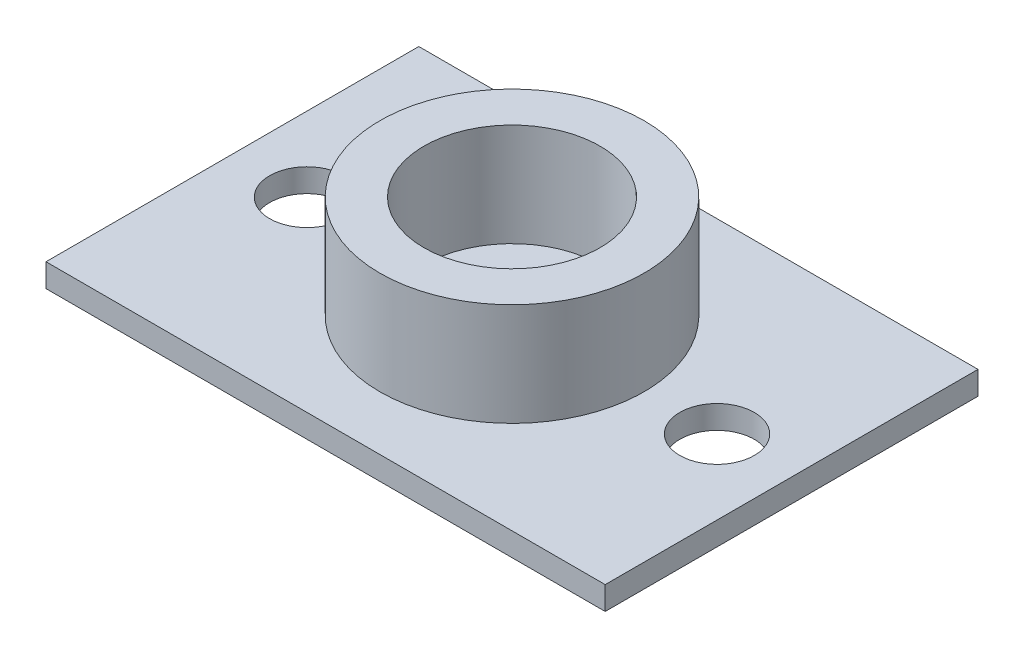
ISO-10303-21;
HEADER;
FILE_DESCRIPTION(('STEP AP214'),'2;1');
FILE_NAME('part.step','',(''),(''),'','','');
FILE_SCHEMA(('AUTOMOTIVE_DESIGN { 1 0 10303 214 1 1 1 1 }'));
ENDSEC;
DATA;
#1=APPLICATION_CONTEXT('core data for automotive mechanical design processes');
#2=APPLICATION_PROTOCOL_DEFINITION('international standard','automotive_design',2000,#1);
#3=PRODUCT_CONTEXT('',#1,'mechanical');
#4=PRODUCT('Part','Part','',(#3));
#5=PRODUCT_RELATED_PRODUCT_CATEGORY('part','',(#4));
#6=PRODUCT_DEFINITION_FORMATION('','',#4);
#7=PRODUCT_DEFINITION_CONTEXT('part definition',#1,'design');
#8=PRODUCT_DEFINITION('design','',#6,#7);
#9=PRODUCT_DEFINITION_SHAPE('','',#8);
#10=(LENGTH_UNIT() NAMED_UNIT(*) SI_UNIT(.MILLI.,.METRE.));
#11=(NAMED_UNIT(*) PLANE_ANGLE_UNIT() SI_UNIT($,.RADIAN.));
#12=(NAMED_UNIT(*) SI_UNIT($,.STERADIAN.) SOLID_ANGLE_UNIT());
#13=UNCERTAINTY_MEASURE_WITH_UNIT(LENGTH_MEASURE(1.E-05),#10,'distance_accuracy_value','');
#14=(GEOMETRIC_REPRESENTATION_CONTEXT(3) GLOBAL_UNCERTAINTY_ASSIGNED_CONTEXT((#13)) GLOBAL_UNIT_ASSIGNED_CONTEXT((#10,
#11,#12)) REPRESENTATION_CONTEXT('',''));
#15=CARTESIAN_POINT('',(0.,0.,0.));
#16=DIRECTION('',(0.,0.,1.));
#17=DIRECTION('',(1.,0.,0.));
#18=AXIS2_PLACEMENT_3D('',#15,#16,#17);
#19=CARTESIAN_POINT('',(0.,1.5875,0.));
#20=DIRECTION('',(0.,1.,0.));
#21=DIRECTION('',(0.,0.,1.));
#22=AXIS2_PLACEMENT_3D('',#19,#20,#21);
#23=PLANE('',#22);
#24=CARTESIAN_POINT('',(-20.7617391304348,1.5875,0.));
#25=DIRECTION('',(0.,1.,0.));
#26=DIRECTION('',(0.,0.,1.));
#27=AXIS2_PLACEMENT_3D('',#24,#25,#26);
#28=CIRCLE('',#27,2.54);
#29=CARTESIAN_POINT('',(-20.7617391304348,1.5875,2.54));
#30=VERTEX_POINT('',#29);
#31=EDGE_CURVE('E166',#30,#30,#28,.T.);
#32=ORIENTED_EDGE('',*,*,#31,.F.);
#33=EDGE_LOOP('',(#32));
#34=FACE_BOUND('',#33,.T.);
#35=CARTESIAN_POINT('',(7.17826086956524,1.5875,0.));
#36=DIRECTION('',(0.,1.,0.));
#37=DIRECTION('',(0.,0.,1.));
#38=AXIS2_PLACEMENT_3D('',#35,#36,#37);
#39=CIRCLE('',#38,2.54);
#40=CARTESIAN_POINT('',(7.17826086956524,1.5875,2.54));
#41=VERTEX_POINT('',#40);
#42=EDGE_CURVE('E168',#41,#41,#39,.T.);
#43=ORIENTED_EDGE('',*,*,#42,.F.);
#44=EDGE_LOOP('',(#43));
#45=FACE_BOUND('',#44,.T.);
#46=DIRECTION('',(0.,0.,1.));
#47=VECTOR('',#46,1.);
#48=CARTESIAN_POINT('',(-25.8417391304348,1.5875,-12.7));
#49=LINE('',#48,#47);
#50=CARTESIAN_POINT('',(-25.8417391304348,1.5875,-12.7));
#51=VERTEX_POINT('',#50);
#52=CARTESIAN_POINT('',(-25.8417391304348,1.5875,12.7));
#53=VERTEX_POINT('',#52);
#54=EDGE_CURVE('E86',#51,#53,#49,.T.);
#55=ORIENTED_EDGE('',*,*,#54,.T.);
#56=DIRECTION('',(1.,0.,0.));
#57=VECTOR('',#56,1.);
#58=CARTESIAN_POINT('',(-25.8417391304348,1.5875,12.7));
#59=LINE('',#58,#57);
#60=CARTESIAN_POINT('',(12.2582608695652,1.5875,12.7));
#61=VERTEX_POINT('',#60);
#62=EDGE_CURVE('E81',#53,#61,#59,.T.);
#63=ORIENTED_EDGE('',*,*,#62,.T.);
#64=DIRECTION('',(0.,0.,-1.));
#65=VECTOR('',#64,1.);
#66=CARTESIAN_POINT('',(12.2582608695652,1.5875,-12.7));
#67=LINE('',#66,#65);
#68=CARTESIAN_POINT('',(12.2582608695652,1.5875,-12.7));
#69=VERTEX_POINT('',#68);
#70=EDGE_CURVE('E84',#61,#69,#67,.T.);
#71=ORIENTED_EDGE('',*,*,#70,.T.);
#72=DIRECTION('',(-1.,0.,0.));
#73=VECTOR('',#72,1.);
#74=CARTESIAN_POINT('',(-25.8417391304348,1.5875,-12.7));
#75=LINE('',#74,#73);
#76=EDGE_CURVE('E50',#69,#51,#75,.T.);
#77=ORIENTED_EDGE('',*,*,#76,.T.);
#78=EDGE_LOOP('',(#55,#63,#71,#77));
#79=FACE_BOUND('',#78,.T.);
#80=CARTESIAN_POINT('',(-6.79173913043476,1.5875,0.));
#81=DIRECTION('',(0.,1.,0.));
#82=DIRECTION('',(0.,0.,1.));
#83=AXIS2_PLACEMENT_3D('',#80,#81,#82);
#84=CIRCLE('',#83,9.);
#85=CARTESIAN_POINT('',(-6.79173913043476,1.5875,8.99999999999999));
#86=VERTEX_POINT('',#85);
#87=EDGE_CURVE('E178',#86,#86,#84,.T.);
#88=ORIENTED_EDGE('',*,*,#87,.F.);
#89=EDGE_LOOP('',(#88));
#90=FACE_BOUND('',#89,.T.);
#91=ADVANCED_FACE('F33',(#34,#45,#79,#90),#23,.T.);
#92=CARTESIAN_POINT('',(-25.8417391304348,1.5875,-12.7));
#93=DIRECTION('',(1.,0.,0.));
#94=DIRECTION('',(0.,0.,-1.));
#95=AXIS2_PLACEMENT_3D('',#92,#93,#94);
#96=PLANE('',#95);
#97=DIRECTION('',(0.,0.,1.));
#98=VECTOR('',#97,1.);
#99=CARTESIAN_POINT('',(-25.8417391304348,0.,-12.7));
#100=LINE('',#99,#98);
#101=CARTESIAN_POINT('',(-25.8417391304348,0.,-12.7));
#102=VERTEX_POINT('',#101);
#103=CARTESIAN_POINT('',(-25.8417391304348,0.,12.7));
#104=VERTEX_POINT('',#103);
#105=EDGE_CURVE('E100',#102,#104,#100,.T.);
#106=ORIENTED_EDGE('',*,*,#105,.T.);
#107=DIRECTION('',(0.,-1.,0.));
#108=VECTOR('',#107,1.);
#109=CARTESIAN_POINT('',(-25.8417391304348,1.5875,12.7));
#110=LINE('',#109,#108);
#111=EDGE_CURVE('E42',#53,#104,#110,.T.);
#112=ORIENTED_EDGE('',*,*,#111,.F.);
#113=ORIENTED_EDGE('',*,*,#54,.F.);
#114=DIRECTION('',(0.,-1.,0.));
#115=VECTOR('',#114,1.);
#116=CARTESIAN_POINT('',(-25.8417391304348,1.5875,-12.7));
#117=LINE('',#116,#115);
#118=EDGE_CURVE('E96',#51,#102,#117,.T.);
#119=ORIENTED_EDGE('',*,*,#118,.T.);
#120=EDGE_LOOP('',(#106,#112,#113,#119));
#121=FACE_BOUND('',#120,.T.);
#122=ADVANCED_FACE('F35',(#121),#96,.F.);
#123=CARTESIAN_POINT('',(-25.8417391304348,1.5875,12.7));
#124=DIRECTION('',(0.,0.,-1.));
#125=DIRECTION('',(-1.,0.,0.));
#126=AXIS2_PLACEMENT_3D('',#123,#124,#125);
#127=PLANE('',#126);
#128=DIRECTION('',(1.,0.,0.));
#129=VECTOR('',#128,1.);
#130=CARTESIAN_POINT('',(-25.8417391304348,0.,12.7));
#131=LINE('',#130,#129);
#132=CARTESIAN_POINT('',(12.2582608695652,0.,12.7));
#133=VERTEX_POINT('',#132);
#134=EDGE_CURVE('E91',#104,#133,#131,.T.);
#135=ORIENTED_EDGE('',*,*,#134,.T.);
#136=DIRECTION('',(0.,-1.,0.));
#137=VECTOR('',#136,1.);
#138=CARTESIAN_POINT('',(12.2582608695652,1.5875,12.7));
#139=LINE('',#138,#137);
#140=EDGE_CURVE('E89',#61,#133,#139,.T.);
#141=ORIENTED_EDGE('',*,*,#140,.F.);
#142=ORIENTED_EDGE('',*,*,#62,.F.);
#143=ORIENTED_EDGE('',*,*,#111,.T.);
#144=EDGE_LOOP('',(#135,#141,#142,#143));
#145=FACE_BOUND('',#144,.T.);
#146=ADVANCED_FACE('F90',(#145),#127,.F.);
#147=CARTESIAN_POINT('',(12.2582608695652,1.5875,-12.7));
#148=DIRECTION('',(-1.,0.,0.));
#149=DIRECTION('',(0.,0.,1.));
#150=AXIS2_PLACEMENT_3D('',#147,#148,#149);
#151=PLANE('',#150);
#152=DIRECTION('',(0.,0.,-1.));
#153=VECTOR('',#152,1.);
#154=CARTESIAN_POINT('',(12.2582608695652,0.,-12.7));
#155=LINE('',#154,#153);
#156=CARTESIAN_POINT('',(12.2582608695652,0.,-12.7));
#157=VERTEX_POINT('',#156);
#158=EDGE_CURVE('E67',#133,#157,#155,.T.);
#159=ORIENTED_EDGE('',*,*,#158,.T.);
#160=DIRECTION('',(0.,-1.,0.));
#161=VECTOR('',#160,1.);
#162=CARTESIAN_POINT('',(12.2582608695652,1.5875,-12.7));
#163=LINE('',#162,#161);
#164=EDGE_CURVE('E92',#69,#157,#163,.T.);
#165=ORIENTED_EDGE('',*,*,#164,.F.);
#166=ORIENTED_EDGE('',*,*,#70,.F.);
#167=ORIENTED_EDGE('',*,*,#140,.T.);
#168=EDGE_LOOP('',(#159,#165,#166,#167));
#169=FACE_BOUND('',#168,.T.);
#170=ADVANCED_FACE('F94',(#169),#151,.F.);
#171=CARTESIAN_POINT('',(-25.8417391304348,1.5875,-12.7));
#172=DIRECTION('',(0.,0.,1.));
#173=DIRECTION('',(1.,0.,0.));
#174=AXIS2_PLACEMENT_3D('',#171,#172,#173);
#175=PLANE('',#174);
#176=DIRECTION('',(-1.,0.,0.));
#177=VECTOR('',#176,1.);
#178=CARTESIAN_POINT('',(-25.8417391304348,0.,-12.7));
#179=LINE('',#178,#177);
#180=EDGE_CURVE('E73',#157,#102,#179,.T.);
#181=ORIENTED_EDGE('',*,*,#180,.T.);
#182=ORIENTED_EDGE('',*,*,#118,.F.);
#183=ORIENTED_EDGE('',*,*,#76,.F.);
#184=ORIENTED_EDGE('',*,*,#164,.T.);
#185=EDGE_LOOP('',(#181,#182,#183,#184));
#186=FACE_BOUND('',#185,.T.);
#187=ADVANCED_FACE('F114',(#186),#175,.F.);
#188=CARTESIAN_POINT('',(0.,0.,0.));
#189=DIRECTION('',(0.,1.,0.));
#190=DIRECTION('',(0.,0.,1.));
#191=AXIS2_PLACEMENT_3D('',#188,#189,#190);
#192=PLANE('',#191);
#193=CARTESIAN_POINT('',(-20.7617391304348,0.,0.));
#194=DIRECTION('',(0.,1.,0.));
#195=DIRECTION('',(0.,0.,1.));
#196=AXIS2_PLACEMENT_3D('',#193,#194,#195);
#197=CIRCLE('',#196,2.54);
#198=CARTESIAN_POINT('',(-20.7617391304348,0.,2.54));
#199=VERTEX_POINT('',#198);
#200=EDGE_CURVE('E164',#199,#199,#197,.T.);
#201=ORIENTED_EDGE('',*,*,#200,.T.);
#202=EDGE_LOOP('',(#201));
#203=FACE_BOUND('',#202,.T.);
#204=CARTESIAN_POINT('',(7.17826086956524,0.,0.));
#205=DIRECTION('',(0.,1.,0.));
#206=DIRECTION('',(0.,0.,1.));
#207=AXIS2_PLACEMENT_3D('',#204,#205,#206);
#208=CIRCLE('',#207,2.54);
#209=CARTESIAN_POINT('',(7.17826086956524,0.,2.54));
#210=VERTEX_POINT('',#209);
#211=EDGE_CURVE('E171',#210,#210,#208,.T.);
#212=ORIENTED_EDGE('',*,*,#211,.T.);
#213=EDGE_LOOP('',(#212));
#214=FACE_BOUND('',#213,.T.);
#215=ORIENTED_EDGE('',*,*,#105,.F.);
#216=ORIENTED_EDGE('',*,*,#180,.F.);
#217=ORIENTED_EDGE('',*,*,#158,.F.);
#218=ORIENTED_EDGE('',*,*,#134,.F.);
#219=EDGE_LOOP('',(#215,#216,#217,#218));
#220=FACE_BOUND('',#219,.T.);
#221=ADVANCED_FACE('F111',(#203,#214,#220),#192,.F.);
#222=CARTESIAN_POINT('',(-6.79173913043476,8.5875,0.));
#223=DIRECTION('',(0.,1.,0.));
#224=DIRECTION('',(0.,0.,1.));
#225=AXIS2_PLACEMENT_3D('',#222,#223,#224);
#226=PLANE('',#225);
#227=CARTESIAN_POINT('',(-6.79173913043476,8.5875,0.));
#228=DIRECTION('',(0.,1.,0.));
#229=DIRECTION('',(0.,0.,1.));
#230=AXIS2_PLACEMENT_3D('',#227,#228,#229);
#231=CIRCLE('',#230,9.);
#232=CARTESIAN_POINT('',(-6.79173913043476,8.5875,8.99999999999999));
#233=VERTEX_POINT('',#232);
#234=EDGE_CURVE('E103',#233,#233,#231,.T.);
#235=ORIENTED_EDGE('',*,*,#234,.T.);
#236=EDGE_LOOP('',(#235));
#237=FACE_BOUND('',#236,.T.);
#238=CARTESIAN_POINT('',(-6.79173913043476,8.5875,0.));
#239=DIRECTION('',(0.,1.,0.));
#240=DIRECTION('',(0.,0.,1.));
#241=AXIS2_PLACEMENT_3D('',#238,#239,#240);
#242=CIRCLE('',#241,6.);
#243=CARTESIAN_POINT('',(-6.79173913043476,8.5875,5.99999999999999));
#244=VERTEX_POINT('',#243);
#245=EDGE_CURVE('E174',#244,#244,#242,.T.);
#246=ORIENTED_EDGE('',*,*,#245,.F.);
#247=EDGE_LOOP('',(#246));
#248=FACE_BOUND('',#247,.T.);
#249=ADVANCED_FACE('F113',(#237,#248),#226,.T.);
#250=CARTESIAN_POINT('',(-6.79173913043476,8.5875,0.));
#251=DIRECTION('',(0.,-1.,0.));
#252=DIRECTION('',(0.,0.,-1.));
#253=AXIS2_PLACEMENT_3D('',#250,#251,#252);
#254=CYLINDRICAL_SURFACE('',#253,9.);
#255=ORIENTED_EDGE('',*,*,#234,.F.);
#256=EDGE_LOOP('',(#255));
#257=FACE_BOUND('',#256,.T.);
#258=ORIENTED_EDGE('',*,*,#87,.T.);
#259=EDGE_LOOP('',(#258));
#260=FACE_BOUND('',#259,.T.);
#261=ADVANCED_FACE('F121',(#257,#260),#254,.T.);
#262=CARTESIAN_POINT('',(-6.79173913043476,8.5875,0.));
#263=DIRECTION('',(0.,-1.,0.));
#264=DIRECTION('',(0.,0.,-1.));
#265=AXIS2_PLACEMENT_3D('',#262,#263,#264);
#266=CYLINDRICAL_SURFACE('',#265,6.);
#267=ORIENTED_EDGE('',*,*,#245,.T.);
#268=EDGE_LOOP('',(#267));
#269=FACE_BOUND('',#268,.T.);
#270=CARTESIAN_POINT('',(-6.79173913043476,1.5875,0.));
#271=DIRECTION('',(0.,1.,0.));
#272=DIRECTION('',(0.,0.,1.));
#273=AXIS2_PLACEMENT_3D('',#270,#271,#272);
#274=CIRCLE('',#273,6.);
#275=CARTESIAN_POINT('',(-6.79173913043476,1.5875,5.99999999999999));
#276=VERTEX_POINT('',#275);
#277=EDGE_CURVE('E11',#276,#276,#274,.F.);
#278=ORIENTED_EDGE('',*,*,#277,.T.);
#279=EDGE_LOOP('',(#278));
#280=FACE_BOUND('',#279,.T.);
#281=ADVANCED_FACE('F139',(#269,#280),#266,.F.);
#282=ORIENTED_EDGE('',*,*,#277,.F.);
#283=EDGE_LOOP('',(#282));
#284=FACE_BOUND('',#283,.T.);
#285=ADVANCED_FACE('F130',(#284),#23,.T.);
#286=CARTESIAN_POINT('',(7.17826086956524,0.,0.));
#287=DIRECTION('',(0.,1.,0.));
#288=DIRECTION('',(0.,0.,1.));
#289=AXIS2_PLACEMENT_3D('',#286,#287,#288);
#290=CYLINDRICAL_SURFACE('',#289,2.54);
#291=ORIENTED_EDGE('',*,*,#211,.F.);
#292=EDGE_LOOP('',(#291));
#293=FACE_BOUND('',#292,.T.);
#294=ORIENTED_EDGE('',*,*,#42,.T.);
#295=EDGE_LOOP('',(#294));
#296=FACE_BOUND('',#295,.T.);
#297=ADVANCED_FACE('F138',(#293,#296),#290,.F.);
#298=CARTESIAN_POINT('',(-20.7617391304348,0.,0.));
#299=DIRECTION('',(0.,1.,0.));
#300=DIRECTION('',(0.,0.,1.));
#301=AXIS2_PLACEMENT_3D('',#298,#299,#300);
#302=CYLINDRICAL_SURFACE('',#301,2.54);
#303=ORIENTED_EDGE('',*,*,#200,.F.);
#304=EDGE_LOOP('',(#303));
#305=FACE_BOUND('',#304,.T.);
#306=ORIENTED_EDGE('',*,*,#31,.T.);
#307=EDGE_LOOP('',(#306));
#308=FACE_BOUND('',#307,.T.);
#309=ADVANCED_FACE('F145',(#305,#308),#302,.F.);
#310=CLOSED_SHELL('',(#91,#122,#146,#170,#187,#221,#249,#261,#281,#285,#297,#309));
#311=MANIFOLD_SOLID_BREP('B2',#310);
#312=ADVANCED_BREP_SHAPE_REPRESENTATION('',(#18,#311),#14);
#313=SHAPE_DEFINITION_REPRESENTATION(#9,#312);
ENDSEC;
END-ISO-10303-21;
